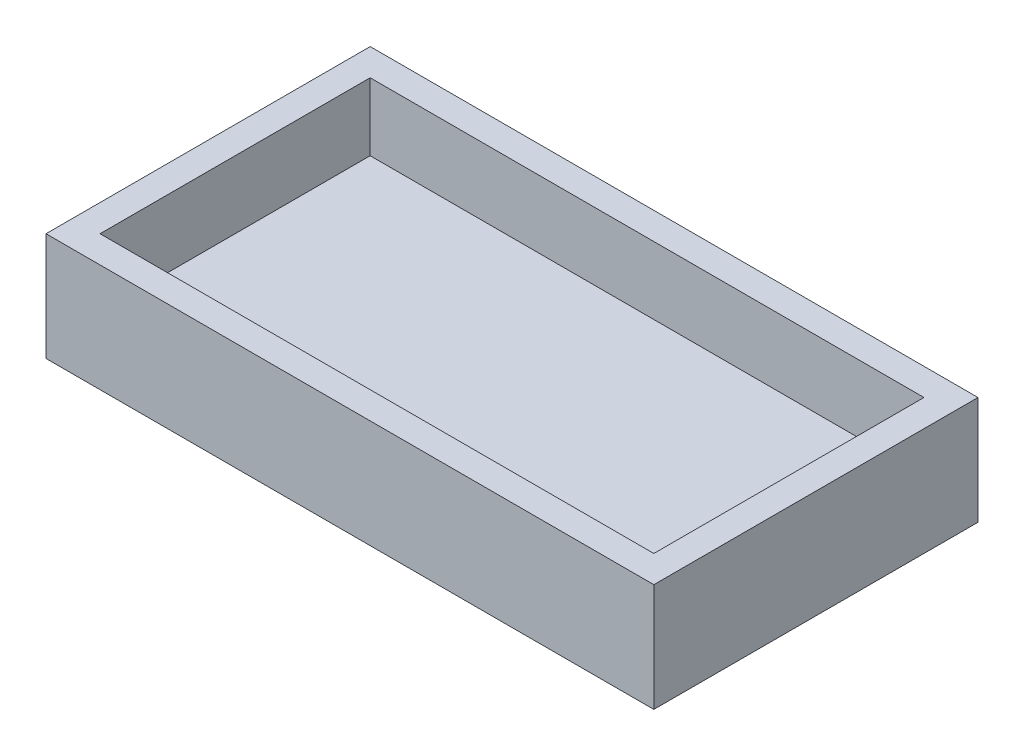
ISO-10303-21;
HEADER;
FILE_DESCRIPTION(('STEP AP214'),'2;1');
FILE_NAME('part.step','',(''),(''),'','','');
FILE_SCHEMA(('AUTOMOTIVE_DESIGN { 1 0 10303 214 1 1 1 1 }'));
ENDSEC;
DATA;
#1=APPLICATION_CONTEXT('core data for automotive mechanical design processes');
#2=APPLICATION_PROTOCOL_DEFINITION('international standard','automotive_design',2000,#1);
#3=PRODUCT_CONTEXT('',#1,'mechanical');
#4=PRODUCT('Part','Part','',(#3));
#5=PRODUCT_RELATED_PRODUCT_CATEGORY('part','',(#4));
#6=PRODUCT_DEFINITION_FORMATION('','',#4);
#7=PRODUCT_DEFINITION_CONTEXT('part definition',#1,'design');
#8=PRODUCT_DEFINITION('design','',#6,#7);
#9=PRODUCT_DEFINITION_SHAPE('','',#8);
#10=(LENGTH_UNIT() NAMED_UNIT(*) SI_UNIT(.MILLI.,.METRE.));
#11=(NAMED_UNIT(*) PLANE_ANGLE_UNIT() SI_UNIT($,.RADIAN.));
#12=(NAMED_UNIT(*) SI_UNIT($,.STERADIAN.) SOLID_ANGLE_UNIT());
#13=UNCERTAINTY_MEASURE_WITH_UNIT(LENGTH_MEASURE(1.E-05),#10,'distance_accuracy_value','');
#14=(GEOMETRIC_REPRESENTATION_CONTEXT(3) GLOBAL_UNCERTAINTY_ASSIGNED_CONTEXT((#13)) GLOBAL_UNIT_ASSIGNED_CONTEXT((#10,
#11,#12)) REPRESENTATION_CONTEXT('',''));
#15=CARTESIAN_POINT('',(0.,0.,0.));
#16=DIRECTION('',(0.,0.,1.));
#17=DIRECTION('',(1.,0.,0.));
#18=AXIS2_PLACEMENT_3D('',#15,#16,#17);
#19=CARTESIAN_POINT('',(0.,3.,0.));
#20=DIRECTION('',(0.,1.,0.));
#21=DIRECTION('',(0.,0.,1.));
#22=AXIS2_PLACEMENT_3D('',#19,#20,#21);
#23=PLANE('',#22);
#24=DIRECTION('',(0.,0.,-1.));
#25=VECTOR('',#24,1.);
#26=CARTESIAN_POINT('',(20.5,3.,-10.));
#27=LINE('',#26,#25);
#28=CARTESIAN_POINT('',(20.5,3.,10.));
#29=VERTEX_POINT('',#28);
#30=CARTESIAN_POINT('',(20.5,3.,-10.));
#31=VERTEX_POINT('',#30);
#32=EDGE_CURVE('E145',#29,#31,#27,.T.);
#33=ORIENTED_EDGE('',*,*,#32,.T.);
#34=DIRECTION('',(-1.,0.,0.));
#35=VECTOR('',#34,1.);
#36=CARTESIAN_POINT('',(-20.5,3.,-10.));
#37=LINE('',#36,#35);
#38=CARTESIAN_POINT('',(-20.5,3.,-10.));
#39=VERTEX_POINT('',#38);
#40=EDGE_CURVE('E58',#31,#39,#37,.T.);
#41=ORIENTED_EDGE('',*,*,#40,.T.);
#42=DIRECTION('',(0.,0.,1.));
#43=VECTOR('',#42,1.);
#44=CARTESIAN_POINT('',(-20.5,3.,-10.));
#45=LINE('',#44,#43);
#46=CARTESIAN_POINT('',(-20.5,3.,9.99999999999999));
#47=VERTEX_POINT('',#46);
#48=EDGE_CURVE('E43',#39,#47,#45,.T.);
#49=ORIENTED_EDGE('',*,*,#48,.T.);
#50=DIRECTION('',(1.,0.,0.));
#51=VECTOR('',#50,1.);
#52=CARTESIAN_POINT('',(-20.5,3.,10.));
#53=LINE('',#52,#51);
#54=EDGE_CURVE('E12',#47,#29,#53,.T.);
#55=ORIENTED_EDGE('',*,*,#54,.T.);
#56=EDGE_LOOP('',(#33,#41,#49,#55));
#57=FACE_BOUND('',#56,.T.);
#58=ADVANCED_FACE('F35',(#57),#23,.T.);
#59=CARTESIAN_POINT('',(22.5,64.,-12.));
#60=DIRECTION('',(0.,0.,-1.));
#61=DIRECTION('',(-1.,0.,0.));
#62=AXIS2_PLACEMENT_3D('',#59,#60,#61);
#63=PLANE('',#62);
#64=DIRECTION('',(0.,-1.,0.));
#65=VECTOR('',#64,1.);
#66=CARTESIAN_POINT('',(-22.5,64.,-12.));
#67=LINE('',#66,#65);
#68=CARTESIAN_POINT('',(-22.5,8.,-12.));
#69=VERTEX_POINT('',#68);
#70=CARTESIAN_POINT('',(-22.5,0.,-12.));
#71=VERTEX_POINT('',#70);
#72=EDGE_CURVE('E113',#69,#71,#67,.T.);
#73=ORIENTED_EDGE('',*,*,#72,.F.);
#74=DIRECTION('',(1.,0.,0.));
#75=VECTOR('',#74,1.);
#76=CARTESIAN_POINT('',(22.5,8.,-12.));
#77=LINE('',#76,#75);
#78=CARTESIAN_POINT('',(22.5,8.,-12.));
#79=VERTEX_POINT('',#78);
#80=EDGE_CURVE('E146',#69,#79,#77,.T.);
#81=ORIENTED_EDGE('',*,*,#80,.T.);
#82=DIRECTION('',(0.,-1.,0.));
#83=VECTOR('',#82,1.);
#84=CARTESIAN_POINT('',(22.5,64.,-12.));
#85=LINE('',#84,#83);
#86=CARTESIAN_POINT('',(22.5,0.,-12.));
#87=VERTEX_POINT('',#86);
#88=EDGE_CURVE('E127',#79,#87,#85,.T.);
#89=ORIENTED_EDGE('',*,*,#88,.T.);
#90=DIRECTION('',(1.,0.,0.));
#91=VECTOR('',#90,1.);
#92=CARTESIAN_POINT('',(22.5,0.,-12.));
#93=LINE('',#92,#91);
#94=EDGE_CURVE('E132',#71,#87,#93,.T.);
#95=ORIENTED_EDGE('',*,*,#94,.F.);
#96=EDGE_LOOP('',(#73,#81,#89,#95));
#97=FACE_BOUND('',#96,.T.);
#98=ADVANCED_FACE('F180',(#97),#63,.T.);
#99=CARTESIAN_POINT('',(-22.5,64.,-12.));
#100=DIRECTION('',(-1.,0.,0.));
#101=DIRECTION('',(0.,0.,1.));
#102=AXIS2_PLACEMENT_3D('',#99,#100,#101);
#103=PLANE('',#102);
#104=DIRECTION('',(0.,-1.,0.));
#105=VECTOR('',#104,1.);
#106=CARTESIAN_POINT('',(-22.5,64.,12.));
#107=LINE('',#106,#105);
#108=CARTESIAN_POINT('',(-22.5,8.,12.));
#109=VERTEX_POINT('',#108);
#110=CARTESIAN_POINT('',(-22.5,0.,12.));
#111=VERTEX_POINT('',#110);
#112=EDGE_CURVE('E112',#109,#111,#107,.T.);
#113=ORIENTED_EDGE('',*,*,#112,.F.);
#114=DIRECTION('',(0.,0.,-1.));
#115=VECTOR('',#114,1.);
#116=CARTESIAN_POINT('',(-22.5,8.,-12.));
#117=LINE('',#116,#115);
#118=EDGE_CURVE('E109',#109,#69,#117,.T.);
#119=ORIENTED_EDGE('',*,*,#118,.T.);
#120=ORIENTED_EDGE('',*,*,#72,.T.);
#121=DIRECTION('',(0.,0.,-1.));
#122=VECTOR('',#121,1.);
#123=CARTESIAN_POINT('',(-22.5,0.,-12.));
#124=LINE('',#123,#122);
#125=EDGE_CURVE('E141',#111,#71,#124,.T.);
#126=ORIENTED_EDGE('',*,*,#125,.F.);
#127=EDGE_LOOP('',(#113,#119,#120,#126));
#128=FACE_BOUND('',#127,.T.);
#129=ADVANCED_FACE('F184',(#128),#103,.T.);
#130=CARTESIAN_POINT('',(22.5,64.,12.));
#131=DIRECTION('',(0.,0.,1.));
#132=DIRECTION('',(1.,0.,0.));
#133=AXIS2_PLACEMENT_3D('',#130,#131,#132);
#134=PLANE('',#133);
#135=DIRECTION('',(0.,-1.,0.));
#136=VECTOR('',#135,1.);
#137=CARTESIAN_POINT('',(22.5,64.,12.));
#138=LINE('',#137,#136);
#139=CARTESIAN_POINT('',(22.5,8.,12.));
#140=VERTEX_POINT('',#139);
#141=CARTESIAN_POINT('',(22.5,0.,12.));
#142=VERTEX_POINT('',#141);
#143=EDGE_CURVE('E116',#140,#142,#138,.T.);
#144=ORIENTED_EDGE('',*,*,#143,.F.);
#145=DIRECTION('',(-1.,0.,0.));
#146=VECTOR('',#145,1.);
#147=CARTESIAN_POINT('',(22.5,8.,12.));
#148=LINE('',#147,#146);
#149=EDGE_CURVE('E101',#140,#109,#148,.T.);
#150=ORIENTED_EDGE('',*,*,#149,.T.);
#151=ORIENTED_EDGE('',*,*,#112,.T.);
#152=DIRECTION('',(-1.,0.,0.));
#153=VECTOR('',#152,1.);
#154=CARTESIAN_POINT('',(22.5,0.,12.));
#155=LINE('',#154,#153);
#156=EDGE_CURVE('E119',#142,#111,#155,.T.);
#157=ORIENTED_EDGE('',*,*,#156,.F.);
#158=EDGE_LOOP('',(#144,#150,#151,#157));
#159=FACE_BOUND('',#158,.T.);
#160=ADVANCED_FACE('F117',(#159),#134,.T.);
#161=CARTESIAN_POINT('',(22.5,64.,-12.));
#162=DIRECTION('',(1.,0.,0.));
#163=DIRECTION('',(0.,0.,-1.));
#164=AXIS2_PLACEMENT_3D('',#161,#162,#163);
#165=PLANE('',#164);
#166=ORIENTED_EDGE('',*,*,#88,.F.);
#167=DIRECTION('',(0.,0.,1.));
#168=VECTOR('',#167,1.);
#169=CARTESIAN_POINT('',(22.5,8.,-12.));
#170=LINE('',#169,#168);
#171=EDGE_CURVE('E106',#79,#140,#170,.T.);
#172=ORIENTED_EDGE('',*,*,#171,.T.);
#173=ORIENTED_EDGE('',*,*,#143,.T.);
#174=DIRECTION('',(0.,0.,1.));
#175=VECTOR('',#174,1.);
#176=CARTESIAN_POINT('',(22.5,0.,-12.));
#177=LINE('',#176,#175);
#178=EDGE_CURVE('E268',#87,#142,#177,.T.);
#179=ORIENTED_EDGE('',*,*,#178,.F.);
#180=EDGE_LOOP('',(#166,#172,#173,#179));
#181=FACE_BOUND('',#180,.T.);
#182=ADVANCED_FACE('F126',(#181),#165,.T.);
#183=CARTESIAN_POINT('',(20.5,64.,-10.));
#184=DIRECTION('',(1.,0.,0.));
#185=DIRECTION('',(0.,0.,-1.));
#186=AXIS2_PLACEMENT_3D('',#183,#184,#185);
#187=PLANE('',#186);
#188=ORIENTED_EDGE('',*,*,#32,.F.);
#189=DIRECTION('',(0.,-1.,0.));
#190=VECTOR('',#189,1.);
#191=CARTESIAN_POINT('',(20.5,64.,10.));
#192=LINE('',#191,#190);
#193=CARTESIAN_POINT('',(20.5,8.,10.));
#194=VERTEX_POINT('',#193);
#195=EDGE_CURVE('E50',#194,#29,#192,.T.);
#196=ORIENTED_EDGE('',*,*,#195,.F.);
#197=DIRECTION('',(0.,0.,1.));
#198=VECTOR('',#197,1.);
#199=CARTESIAN_POINT('',(20.5,8.,-10.));
#200=LINE('',#199,#198);
#201=CARTESIAN_POINT('',(20.5,8.,-10.));
#202=VERTEX_POINT('',#201);
#203=EDGE_CURVE('E134',#202,#194,#200,.T.);
#204=ORIENTED_EDGE('',*,*,#203,.F.);
#205=DIRECTION('',(0.,-1.,0.));
#206=VECTOR('',#205,1.);
#207=CARTESIAN_POINT('',(20.5,64.,-10.));
#208=LINE('',#207,#206);
#209=EDGE_CURVE('E123',#202,#31,#208,.T.);
#210=ORIENTED_EDGE('',*,*,#209,.T.);
#211=EDGE_LOOP('',(#188,#196,#204,#210));
#212=FACE_BOUND('',#211,.T.);
#213=ADVANCED_FACE('F187',(#212),#187,.F.);
#214=CARTESIAN_POINT('',(20.5,64.,-10.));
#215=DIRECTION('',(0.,0.,-1.));
#216=DIRECTION('',(-1.,0.,0.));
#217=AXIS2_PLACEMENT_3D('',#214,#215,#216);
#218=PLANE('',#217);
#219=ORIENTED_EDGE('',*,*,#40,.F.);
#220=ORIENTED_EDGE('',*,*,#209,.F.);
#221=DIRECTION('',(1.,0.,0.));
#222=VECTOR('',#221,1.);
#223=CARTESIAN_POINT('',(20.5,8.,-10.));
#224=LINE('',#223,#222);
#225=CARTESIAN_POINT('',(-20.5,8.,-10.));
#226=VERTEX_POINT('',#225);
#227=EDGE_CURVE('E138',#226,#202,#224,.T.);
#228=ORIENTED_EDGE('',*,*,#227,.F.);
#229=DIRECTION('',(0.,-1.,0.));
#230=VECTOR('',#229,1.);
#231=CARTESIAN_POINT('',(-20.5,64.,-10.));
#232=LINE('',#231,#230);
#233=EDGE_CURVE('E154',#226,#39,#232,.T.);
#234=ORIENTED_EDGE('',*,*,#233,.T.);
#235=EDGE_LOOP('',(#219,#220,#228,#234));
#236=FACE_BOUND('',#235,.T.);
#237=ADVANCED_FACE('F168',(#236),#218,.F.);
#238=CARTESIAN_POINT('',(-20.5,64.,-10.));
#239=DIRECTION('',(-1.,0.,0.));
#240=DIRECTION('',(0.,0.,1.));
#241=AXIS2_PLACEMENT_3D('',#238,#239,#240);
#242=PLANE('',#241);
#243=ORIENTED_EDGE('',*,*,#48,.F.);
#244=ORIENTED_EDGE('',*,*,#233,.F.);
#245=DIRECTION('',(0.,0.,-1.));
#246=VECTOR('',#245,1.);
#247=CARTESIAN_POINT('',(-20.5,8.,-10.));
#248=LINE('',#247,#246);
#249=CARTESIAN_POINT('',(-20.5,8.,9.99999999999999));
#250=VERTEX_POINT('',#249);
#251=EDGE_CURVE('E142',#250,#226,#248,.T.);
#252=ORIENTED_EDGE('',*,*,#251,.F.);
#253=DIRECTION('',(0.,-1.,0.));
#254=VECTOR('',#253,1.);
#255=CARTESIAN_POINT('',(-20.5,64.,9.99999999999999));
#256=LINE('',#255,#254);
#257=EDGE_CURVE('E156',#250,#47,#256,.T.);
#258=ORIENTED_EDGE('',*,*,#257,.T.);
#259=EDGE_LOOP('',(#243,#244,#252,#258));
#260=FACE_BOUND('',#259,.T.);
#261=ADVANCED_FACE('F166',(#260),#242,.F.);
#262=CARTESIAN_POINT('',(20.5,64.,10.));
#263=DIRECTION('',(0.,0.,1.));
#264=DIRECTION('',(1.,0.,0.));
#265=AXIS2_PLACEMENT_3D('',#262,#263,#264);
#266=PLANE('',#265);
#267=ORIENTED_EDGE('',*,*,#54,.F.);
#268=ORIENTED_EDGE('',*,*,#257,.F.);
#269=DIRECTION('',(-1.,0.,0.));
#270=VECTOR('',#269,1.);
#271=CARTESIAN_POINT('',(20.5,8.,10.));
#272=LINE('',#271,#270);
#273=EDGE_CURVE('E137',#194,#250,#272,.T.);
#274=ORIENTED_EDGE('',*,*,#273,.F.);
#275=ORIENTED_EDGE('',*,*,#195,.T.);
#276=EDGE_LOOP('',(#267,#268,#274,#275));
#277=FACE_BOUND('',#276,.T.);
#278=ADVANCED_FACE('F169',(#277),#266,.F.);
#279=CARTESIAN_POINT('',(0.,8.,0.));
#280=DIRECTION('',(0.,1.,0.));
#281=DIRECTION('',(0.,0.,1.));
#282=AXIS2_PLACEMENT_3D('',#279,#280,#281);
#283=PLANE('',#282);
#284=ORIENTED_EDGE('',*,*,#80,.F.);
#285=ORIENTED_EDGE('',*,*,#118,.F.);
#286=ORIENTED_EDGE('',*,*,#149,.F.);
#287=ORIENTED_EDGE('',*,*,#171,.F.);
#288=EDGE_LOOP('',(#284,#285,#286,#287));
#289=FACE_BOUND('',#288,.T.);
#290=ORIENTED_EDGE('',*,*,#227,.T.);
#291=ORIENTED_EDGE('',*,*,#203,.T.);
#292=ORIENTED_EDGE('',*,*,#273,.T.);
#293=ORIENTED_EDGE('',*,*,#251,.T.);
#294=EDGE_LOOP('',(#290,#291,#292,#293));
#295=FACE_BOUND('',#294,.T.);
#296=ADVANCED_FACE('F103',(#289,#295),#283,.T.);
#297=CARTESIAN_POINT('',(0.,0.,0.));
#298=DIRECTION('',(0.,1.,0.));
#299=DIRECTION('',(0.,0.,1.));
#300=AXIS2_PLACEMENT_3D('',#297,#298,#299);
#301=PLANE('',#300);
#302=ORIENTED_EDGE('',*,*,#94,.T.);
#303=ORIENTED_EDGE('',*,*,#178,.T.);
#304=ORIENTED_EDGE('',*,*,#156,.T.);
#305=ORIENTED_EDGE('',*,*,#125,.T.);
#306=EDGE_LOOP('',(#302,#303,#304,#305));
#307=FACE_BOUND('',#306,.T.);
#308=ADVANCED_FACE('F37',(#307),#301,.F.);
#309=CLOSED_SHELL('',(#58,#98,#129,#160,#182,#213,#237,#261,#278,#296,#308));
#310=MANIFOLD_SOLID_BREP('B2',#309);
#311=ADVANCED_BREP_SHAPE_REPRESENTATION('',(#18,#310),#14);
#312=SHAPE_DEFINITION_REPRESENTATION(#9,#311);
ENDSEC;
END-ISO-10303-21;
